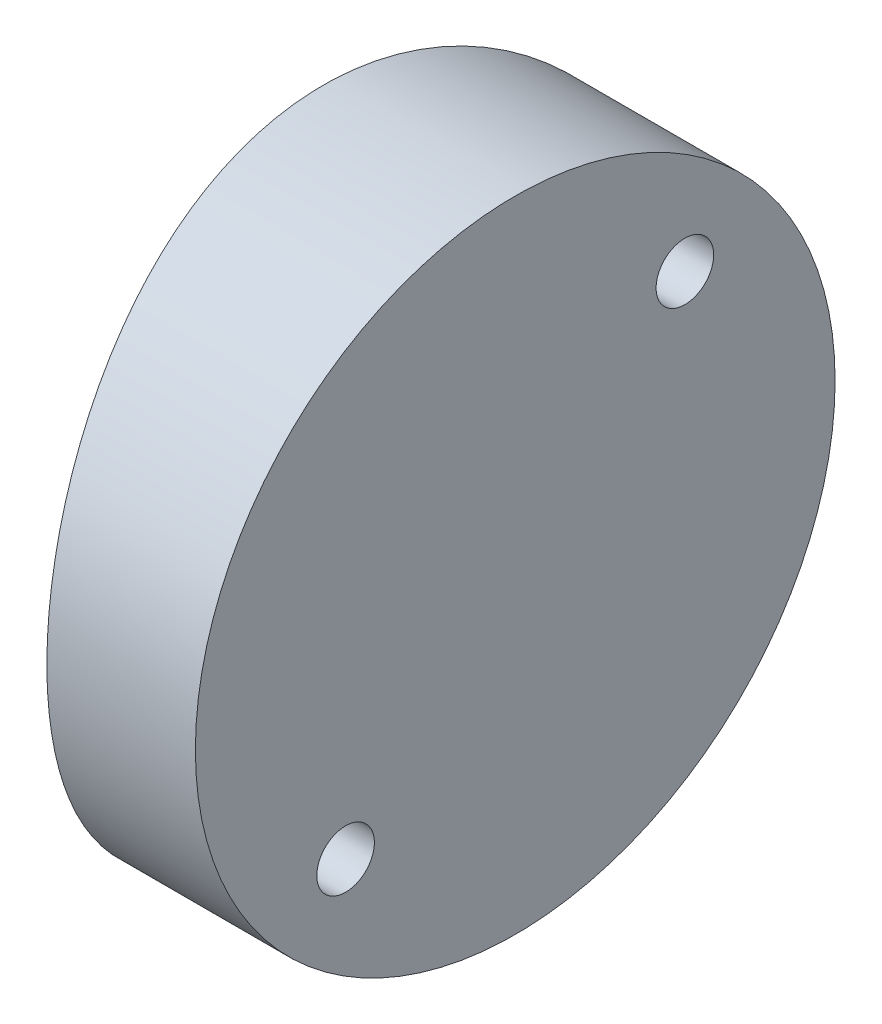
ISO-10303-21;
HEADER;
FILE_DESCRIPTION(('STEP AP214'),'2;1');
FILE_NAME('part.step','',(''),(''),'','','');
FILE_SCHEMA(('AUTOMOTIVE_DESIGN { 1 0 10303 214 1 1 1 1 }'));
ENDSEC;
DATA;
#1=APPLICATION_CONTEXT('core data for automotive mechanical design processes');
#2=APPLICATION_PROTOCOL_DEFINITION('international standard','automotive_design',2000,#1);
#3=PRODUCT_CONTEXT('',#1,'mechanical');
#4=PRODUCT('Part','Part','',(#3));
#5=PRODUCT_RELATED_PRODUCT_CATEGORY('part','',(#4));
#6=PRODUCT_DEFINITION_FORMATION('','',#4);
#7=PRODUCT_DEFINITION_CONTEXT('part definition',#1,'design');
#8=PRODUCT_DEFINITION('design','',#6,#7);
#9=PRODUCT_DEFINITION_SHAPE('','',#8);
#10=(LENGTH_UNIT() NAMED_UNIT(*) SI_UNIT(.MILLI.,.METRE.));
#11=(NAMED_UNIT(*) PLANE_ANGLE_UNIT() SI_UNIT($,.RADIAN.));
#12=(NAMED_UNIT(*) SI_UNIT($,.STERADIAN.) SOLID_ANGLE_UNIT());
#13=UNCERTAINTY_MEASURE_WITH_UNIT(LENGTH_MEASURE(1.E-05),#10,'distance_accuracy_value','');
#14=(GEOMETRIC_REPRESENTATION_CONTEXT(3) GLOBAL_UNCERTAINTY_ASSIGNED_CONTEXT((#13)) GLOBAL_UNIT_ASSIGNED_CONTEXT((#10,
#11,#12)) REPRESENTATION_CONTEXT('',''));
#15=CARTESIAN_POINT('',(0.,0.,0.));
#16=DIRECTION('',(0.,0.,1.));
#17=DIRECTION('',(1.,0.,0.));
#18=AXIS2_PLACEMENT_3D('',#15,#16,#17);
#19=CARTESIAN_POINT('',(12.,0.,0.));
#20=DIRECTION('',(-1.,0.,0.));
#21=DIRECTION('',(0.,0.,1.));
#22=AXIS2_PLACEMENT_3D('',#19,#20,#21);
#23=CYLINDRICAL_SURFACE('',#22,20.);
#24=CARTESIAN_POINT('',(12.,0.,0.));
#25=DIRECTION('',(1.,0.,0.));
#26=DIRECTION('',(0.,0.,-1.));
#27=AXIS2_PLACEMENT_3D('',#24,#25,#26);
#28=CIRCLE('',#27,20.);
#29=CARTESIAN_POINT('',(12.,0.,-20.));
#30=VERTEX_POINT('',#29);
#31=EDGE_CURVE('E10',#30,#30,#28,.T.);
#32=ORIENTED_EDGE('',*,*,#31,.F.);
#33=EDGE_LOOP('',(#32));
#34=FACE_BOUND('',#33,.T.);
#35=CARTESIAN_POINT('',(2.71583852599519,0.,20.));
#36=CARTESIAN_POINT('',(2.71583720419908,0.550918368629555,19.9999979955262));
#37=CARTESIAN_POINT('',(2.70952307294359,1.10187503845956,19.9772172985185));
#38=CARTESIAN_POINT('',(2.68445738640584,2.1997741525709,19.8862887267972));
#39=CARTESIAN_POINT('',(2.66570466817441,2.74671621667071,19.818136610068));
#40=CARTESIAN_POINT('',(2.61632654224703,3.83283472874256,19.6370216003391));
#41=CARTESIAN_POINT('',(2.58569585426865,4.3720076122554,19.5240387775898));
#42=CARTESIAN_POINT('',(2.51348978860518,5.43849703067202,19.2542283143095));
#43=CARTESIAN_POINT('',(2.4719146207721,5.96581379269742,19.0974015144497));
#44=CARTESIAN_POINT('',(2.37912003517492,7.00423404343053,18.7414391089101));
#45=CARTESIAN_POINT('',(2.32791448031755,7.51535961864346,18.5423642668867));
#46=CARTESIAN_POINT('',(2.21730121654067,8.51880006208397,18.1033138320795));
#47=CARTESIAN_POINT('',(2.15789347626827,9.01111485839805,17.8633380829508));
#48=CARTESIAN_POINT('',(2.03254969547388,9.97379657844629,17.3442340818241));
#49=CARTESIAN_POINT('',(1.96661339403171,10.4441626238714,17.0651042648105));
#50=CARTESIAN_POINT('',(1.83003053260491,11.3599958582745,16.4696340357336));
#51=CARTESIAN_POINT('',(1.7593838927973,11.8054626250655,16.1532929930068));
#52=CARTESIAN_POINT('',(1.61365604823284,12.6785221427699,15.4779359071113));
#53=CARTESIAN_POINT('',(1.53851069818374,13.1054831814473,15.1181168094535));
#54=CARTESIAN_POINT('',(1.38737000475925,13.927766105388,14.3641394304632));
#55=CARTESIAN_POINT('',(1.31137464949402,14.3230875474461,13.9699806682643));
#56=CARTESIAN_POINT('',(1.16060916641372,15.0795578950723,13.1498357209291));
#57=CARTESIAN_POINT('',(1.0858391620587,15.4407033745363,12.7238463524525));
#58=CARTESIAN_POINT('',(0.939569981410207,16.1263607771595,11.8428070794406));
#59=CARTESIAN_POINT('',(0.868070822169677,16.4508725093371,11.3877570234234));
#60=CARTESIAN_POINT('',(0.729185410938314,17.0659051030184,10.4440019186042));
#61=CARTESIAN_POINT('',(0.661883679341344,17.3557961932459,9.95487366219161));
#62=CARTESIAN_POINT('',(0.534574695396652,17.8932321652887,8.95295539825706));
#63=CARTESIAN_POINT('',(0.47456754471148,18.140776456948,8.44016506110064));
#64=CARTESIAN_POINT('',(0.363570717175421,18.5915117491791,7.39457532709894));
#65=CARTESIAN_POINT('',(0.312579865798712,18.7947085275753,6.86177854741084));
#66=CARTESIAN_POINT('',(0.221081799935856,19.1550779678764,5.77996599006893));
#67=CARTESIAN_POINT('',(0.180574306630333,19.3122518538382,5.23095064420305));
#68=CARTESIAN_POINT('',(0.112021066604811,19.5761398421684,4.13351206913606));
#69=CARTESIAN_POINT('',(0.0837111230618383,19.6839273166135,3.58536334092753));
#70=CARTESIAN_POINT('',(0.0390282051130342,19.8533116675331,2.4814919821342));
#71=CARTESIAN_POINT('',(0.0226550656279587,19.9149091827889,1.92576945639901));
#72=CARTESIAN_POINT('',(0.00231287184317546,19.9913590232856,0.810972743979539));
#73=CARTESIAN_POINT('',(-0.00165798564619358,20.0062181439063,0.251899056370222));
#74=CARTESIAN_POINT('',(0.00291290405673769,19.9890756548836,-0.865473785968115));
#75=CARTESIAN_POINT('',(0.0114544730304575,19.9570747126834,-1.42377295161553));
#76=CARTESIAN_POINT('',(0.0404339869592479,19.8479018321359,-2.52135571769307));
#77=CARTESIAN_POINT('',(0.0605659765902263,19.7718913424225,-3.06076341662817));
#78=CARTESIAN_POINT('',(0.111941054107678,19.5762680740784,-4.13106184083254));
#79=CARTESIAN_POINT('',(0.143183922711534,19.4566561559578,-4.66195273397211));
#80=CARTESIAN_POINT('',(0.215946928393699,19.1748040741018,-5.71158477741187));
#81=CARTESIAN_POINT('',(0.257467421868833,19.0125624320849,-6.23032550569826));
#82=CARTESIAN_POINT('',(0.349687153961002,18.6467294349784,-7.25217189173379));
#83=CARTESIAN_POINT('',(0.400386537541423,18.443137426831,-7.7552773024053));
#84=CARTESIAN_POINT('',(0.510180514018348,17.9939181773118,-8.74748028027973));
#85=CARTESIAN_POINT('',(0.56935336775221,17.7478941379886,-9.2363894798745));
#86=CARTESIAN_POINT('',(0.694148187869852,17.2170307081084,-10.1917867213776));
#87=CARTESIAN_POINT('',(0.759770176450058,16.9321911839563,-10.6582746861091));
#88=CARTESIAN_POINT('',(0.895758703670676,16.3256216075623,-11.5659888188201));
#89=CARTESIAN_POINT('',(0.966126011005286,16.0038855725124,-12.0072108724652));
#90=CARTESIAN_POINT('',(1.10976484930651,15.3256861572232,-12.86160363953));
#91=CARTESIAN_POINT('',(1.18303644148927,14.9692220447586,-13.2747737611759));
#92=CARTESIAN_POINT('',(1.33284428810774,14.2123742214188,-14.0827611991668));
#93=CARTESIAN_POINT('',(1.40941167732709,13.8109775618472,-14.4766245221965));
#94=CARTESIAN_POINT('',(1.56147492697535,12.976336337106,-15.2292640199665));
#95=CARTESIAN_POINT('',(1.63697076475668,12.5430910999988,-15.5880394540543));
#96=CARTESIAN_POINT('',(1.78476784142875,11.6475416526047,-16.2680947594536));
#97=CARTESIAN_POINT('',(1.85706886150449,11.1852354571523,-16.5893720649617));
#98=CARTESIAN_POINT('',(1.99639557790192,10.234611796305,-17.1921338759909));
#99=CARTESIAN_POINT('',(2.06342129853029,9.74629445077744,-17.4736185648671));
#100=CARTESIAN_POINT('',(2.19062493961388,8.74378523222317,-17.9963259710692));
#101=CARTESIAN_POINT('',(2.25075776920321,8.22945155829049,-18.2372879132319));
#102=CARTESIAN_POINT('',(2.36185979063246,7.18129056511593,-18.6748920170533));
#103=CARTESIAN_POINT('',(2.41282891253737,6.64746309713994,-18.8715338404755));
#104=CARTESIAN_POINT('',(2.50400123028059,5.56425978861829,-19.2188038342948));
#105=CARTESIAN_POINT('',(2.54420661443119,5.0148871336236,-19.3694413584335));
#106=CARTESIAN_POINT('',(2.61257838013558,3.9045821944646,-19.6234178199717));
#107=CARTESIAN_POINT('',(2.64074512950106,3.34365026401526,-19.726758202429));
#108=CARTESIAN_POINT('',(2.68347601664323,2.23140756936548,-19.8828242188132));
#109=CARTESIAN_POINT('',(2.69842161742293,1.68031046308461,-19.9369705715048));
#110=CARTESIAN_POINT('',(2.71565957980208,0.575330472434,-19.9993798372479));
#111=CARTESIAN_POINT('',(2.71795219245947,0.021447643556242,-20.007643660691));
#112=CARTESIAN_POINT('',(2.70981317788567,-1.08494461677384,-19.9782160173178));
#113=CARTESIAN_POINT('',(2.69938279257724,-1.63745417699944,-19.9405290358714));
#114=CARTESIAN_POINT('',(2.66612442334991,-2.73707469895268,-19.8195451229315));
#115=CARTESIAN_POINT('',(2.64329650747951,-3.2841856902956,-19.736248441784));
#116=CARTESIAN_POINT('',(2.58650048179624,-4.35857469453259,-19.5268172340599));
#117=CARTESIAN_POINT('',(2.55275540867861,-4.88603174019373,-19.4015386960339));
#118=CARTESIAN_POINT('',(2.47500448611204,-5.92832913382976,-19.1088443049987));
#119=CARTESIAN_POINT('',(2.43099880347104,-6.4431696867621,-18.9414291370062));
#120=CARTESIAN_POINT('',(2.33397826704948,-7.45689813088412,-18.5657450389627));
#121=CARTESIAN_POINT('',(2.28096253333663,-7.95578445830565,-18.3574721183883));
#122=CARTESIAN_POINT('',(2.16740736150408,-8.93436137495364,-17.901636719721));
#123=CARTESIAN_POINT('',(2.10686775310598,-9.41405152941229,-17.6540733523817));
#124=CARTESIAN_POINT('',(1.97850743681508,-10.3616364681429,-17.11548661598));
#125=CARTESIAN_POINT('',(1.91055596885891,-10.8290404597269,-16.8236278146508));
#126=CARTESIAN_POINT('',(1.80546481084756,-11.5104486579926,-16.3580352677298));
#127=CARTESIAN_POINT('',(1.7699051851663,-11.7343127858372,-16.1981947427043));
#128=CARTESIAN_POINT('',(1.69796068661998,-12.1752320062407,-15.8694473258497));
#129=CARTESIAN_POINT('',(1.66157561938932,-12.3922854658165,-15.7005382856017));
#130=CARTESIAN_POINT('',(1.55156513794229,-13.0326274018404,-15.1806742573283));
#131=CARTESIAN_POINT('',(1.47707281306718,-13.4451720326612,-14.8165313697738));
#132=CARTESIAN_POINT('',(1.32780357156735,-14.238838083619,-14.0555240451393));
#133=CARTESIAN_POINT('',(1.25302665149377,-14.6199591216746,-13.6586592103083));
#134=CARTESIAN_POINT('',(1.14107642560371,-15.1714951873482,-13.0347928155079));
#135=CARTESIAN_POINT('',(1.10326703754078,-15.3543975844182,-12.8188356454708));
#136=CARTESIAN_POINT('',(1.02837237294425,-15.7108895289307,-12.3793376328829));
#137=CARTESIAN_POINT('',(0.991286922913547,-15.8844813255974,-12.1557986434176));
#138=CARTESIAN_POINT('',(0.881487716092404,-16.3909288120467,-11.4742218917358));
#139=CARTESIAN_POINT('',(0.810224975928936,-16.709486469754,-11.0051905556007));
#140=CARTESIAN_POINT('',(0.673619137262284,-17.3059300226829,-10.0412210351254));
#141=CARTESIAN_POINT('',(0.608275862067071,-17.5838171320454,-9.5462836247604));
#142=CARTESIAN_POINT('',(0.485340966914633,-18.0968632016066,-8.53378968620395));
#143=CARTESIAN_POINT('',(0.42774922037299,-18.3320228595772,-8.01623352756527));
#144=CARTESIAN_POINT('',(0.322366348557832,-18.7560885066583,-6.96615659435085));
#145=CARTESIAN_POINT('',(0.27450403894112,-18.945332565737,-6.43377951172493));
#146=CARTESIAN_POINT('',(0.189396189188018,-19.2782875530085,-5.35413230580835));
#147=CARTESIAN_POINT('',(0.152150629904706,-19.4219985633186,-4.80686220937866));
#148=CARTESIAN_POINT('',(0.089355017230541,-19.6626100524458,-3.7015671034604));
#149=CARTESIAN_POINT('',(0.0638028066489135,-19.7595191654669,-3.14354409748071));
#150=CARTESIAN_POINT('',(0.0251274383065969,-19.9056902137932,-2.02086921872247));
#151=CARTESIAN_POINT('',(0.0120039647265277,-19.9549533598029,-1.45621751475102));
#152=CARTESIAN_POINT('',(-0.00122587692838002,-20.0046098488838,-0.342006373503284));
#153=CARTESIAN_POINT('',(-0.00171951763861212,-20.0064571258491,0.207484191740474));
#154=CARTESIAN_POINT('',(0.00934129337656264,-19.9649517231006,1.30462513984724));
#155=CARTESIAN_POINT('',(0.0208954819801355,-19.921600030522,1.85227556263648));
#156=CARTESIAN_POINT('',(0.0557333619197663,-19.7900760707032,2.94176044403704));
#157=CARTESIAN_POINT('',(0.0790165566844254,-19.7019057009516,3.48359514787692));
#158=CARTESIAN_POINT('',(0.136675692879952,-19.4814944613198,4.55762066338955));
#159=CARTESIAN_POINT('',(0.171051683802468,-19.3492533948135,5.08981143202369));
#160=CARTESIAN_POINT('',(0.249691413832764,-19.0428564307918,6.13720586224474));
#161=CARTESIAN_POINT('',(0.293885071252294,-18.8689969684944,6.65250160135735));
#162=CARTESIAN_POINT('',(0.391125021808032,-18.4802494885517,7.66649937953356));
#163=CARTESIAN_POINT('',(0.444171243197424,-18.2653618034233,8.16520155304269));
#164=CARTESIAN_POINT('',(0.557737475067148,-17.796130197976,9.14285422000934));
#165=CARTESIAN_POINT('',(0.618258277244073,-17.5417820973358,9.6218026139965));
#166=CARTESIAN_POINT('',(0.745205728496283,-16.9954417686765,10.5569031827026));
#167=CARTESIAN_POINT('',(0.811632508969956,-16.7034487030534,11.0130548498786));
#168=CARTESIAN_POINT('',(0.950517062442474,-16.0755135025158,11.9116009680227));
#169=CARTESIAN_POINT('',(1.023088426918,-15.7386070110524,12.3533041573464));
#170=CARTESIAN_POINT('',(1.17070667771722,-15.0294641921924,13.2069343867793));
#171=CARTESIAN_POINT('',(1.24575360836312,-14.6572272320196,13.6188608933488));
#172=CARTESIAN_POINT('',(1.3963163105709,-13.8797585542876,14.4104174108039));
#173=CARTESIAN_POINT('',(1.47183219499279,-13.4745185854208,14.7900392961781));
#174=CARTESIAN_POINT('',(1.62125905673518,-12.6337145599183,15.5144184951873));
#175=CARTESIAN_POINT('',(1.69517002855606,-12.1981503993908,15.8591756893648));
#176=CARTESIAN_POINT('',(1.8409371391106,-11.2895484362826,16.5187203553849));
#177=CARTESIAN_POINT('',(1.91271216996388,-10.8158965832217,16.8326805368298));
#178=CARTESIAN_POINT('',(2.05034988167816,-9.84293313497395,17.4195128918304));
#179=CARTESIAN_POINT('',(2.11621229361854,-9.34362037428765,17.6923831968983));
#180=CARTESIAN_POINT('',(2.24000453908631,-8.32305943262842,18.1947791971653));
#181=CARTESIAN_POINT('',(2.29793893952687,-7.80182410827755,18.424329875673));
#182=CARTESIAN_POINT('',(2.40412815426479,-6.74084782086917,18.8383953760499));
#183=CARTESIAN_POINT('',(2.45238428596844,-6.20110938818302,19.0229163281093));
#184=CARTESIAN_POINT('',(2.53070778022321,-5.19676399129988,19.3189300896442));
#185=CARTESIAN_POINT('',(2.56245993531721,-4.73434070733534,19.4374352166582));
#186=CARTESIAN_POINT('',(2.61743880671688,-3.80156746564103,19.6411813358635));
#187=CARTESIAN_POINT('',(2.64066318278791,-3.33121536903039,19.726413197448));
#188=CARTESIAN_POINT('',(2.67803680605951,-2.38530218256131,19.8629973448247));
#189=CARTESIAN_POINT('',(2.69218689021724,-1.90974157722012,19.9143527551861));
#190=CARTESIAN_POINT('',(2.71108694192035,-0.956129746401022,19.9828499232124));
#191=CARTESIAN_POINT('',(2.71583967303146,-0.478079294611533,20.0000017394545));
#192=CARTESIAN_POINT('',(2.71583852599519,0.,20.));
#193=B_SPLINE_CURVE_WITH_KNOTS('',3,(#35,#36,#37,#38,#39,#40,#41,#42,#43,#44,#45,#46,#47,#48,
#49,#50,#51,#52,#53,#54,#55,#56,#57,#58,#59,#60,#61,#62,#63,#64,#65,#66,#67,#68,#69,#70,#71,#72,
#73,#74,#75,#76,#77,#78,#79,#80,#81,#82,#83,#84,#85,#86,#87,#88,#89,#90,#91,#92,#93,#94,#95,#96,
#97,#98,#99,#100,#101,#102,#103,#104,#105,#106,#107,#108,#109,#110,#111,#112,#113,#114,#115,
#116,#117,#118,#119,#120,#121,#122,#123,#124,#125,#126,#127,#128,#129,#130,#131,#132,#133,#134,
#135,#136,#137,#138,#139,#140,#141,#142,#143,#144,#145,#146,#147,#148,#149,#150,#151,#152,#153,
#154,#155,#156,#157,#158,#159,#160,#161,#162,#163,#164,#165,#166,#167,#168,#169,#170,#171,#172,
#173,#174,#175,#176,#177,#178,#179,#180,#181,#182,#183,#184,#185,#186,#187,#188,#189,#190,#191,
#192),.UNSPECIFIED.,.T.,.F.,(4,2,2,2,2,2,2,2,2,2,2,2,2,2,2,2,2,2,2,2,2,2,2,2,2,2,2,2,2,2,2,2,2,
2,2,2,2,2,2,2,2,2,2,2,2,2,2,2,2,2,2,2,2,2,2,2,2,2,2,2,2,2,2,2,2,2,2,2,2,2,2,2,2,2,2,2,2,2,4),
(0.,1.65231646724918,3.30478744006707,4.95799385294111,6.61116856915921,8.26198151246524,
9.91280076618765,11.563686023129,13.2145992636445,14.9028332573599,16.5910908956041,
18.2795176009991,19.9679531082101,21.6835116813128,23.3990941609388,25.1144529919578,
26.8297661959518,28.5057881570069,30.1817869391871,31.8575420336015,33.5332732599203,
35.1666751391554,36.8000447836081,38.4334710762973,40.0669231681476,41.716572363803,
43.3662272373671,45.016149983437,46.6661075248883,48.3667622821504,50.0674529299349,
51.7682598790722,53.4690589910375,55.1804159110329,56.8917858911011,58.6028076779203,
60.3137771848222,61.9735992876109,63.6333884564392,65.2930156221762,66.9526336785195,
68.5802863037356,70.2079124698566,71.8356976833209,73.4635197431162,75.127110556269,
75.95899168933,76.7910707802654,78.454956484337,80.1188624167173,80.9751899408172,
81.831309655657,83.54341297765,85.2554651776656,86.9674894160441,88.6664972596542,
90.3655020391462,92.0641932594963,93.7628413142374,95.4093386147798,97.0557999569512,
98.7021915986812,100.348590586058,101.983594533906,103.618585231283,105.253749253225,
106.888949664009,108.567756622397,110.246593654259,111.925851719845,113.605115538909,
115.321363854389,117.037690189607,118.753023639167,120.468123438766,121.902141616166,
123.336553030226,124.77083212392,126.204689363247),.UNSPECIFIED.);
#194=CARTESIAN_POINT('',(2.71583852599519,0.,20.));
#195=VERTEX_POINT('',#194);
#196=EDGE_CURVE('E78',#195,#195,#193,.T.);
#197=ORIENTED_EDGE('',*,*,#196,.F.);
#198=EDGE_LOOP('',(#197));
#199=FACE_BOUND('',#198,.T.);
#200=ADVANCED_FACE('F37',(#34,#199),#23,.T.);
#201=CARTESIAN_POINT('',(0.,10.6066017177982,-10.6066017177982));
#202=DIRECTION('',(-1.,0.,0.));
#203=DIRECTION('',(0.,0.,1.));
#204=AXIS2_PLACEMENT_3D('',#201,#202,#203);
#205=CYLINDRICAL_SURFACE('',#204,3.25);
#206=CARTESIAN_POINT('',(3.,10.6066017177982,-10.6066017177982));
#207=DIRECTION('',(-1.,0.,0.));
#208=DIRECTION('',(0.,0.,1.));
#209=AXIS2_PLACEMENT_3D('',#206,#207,#208);
#210=CIRCLE('',#209,3.25);
#211=CARTESIAN_POINT('',(3.,10.6066017177982,-7.35660171779819));
#212=VERTEX_POINT('',#211);
#213=EDGE_CURVE('E62',#212,#212,#210,.T.);
#214=ORIENTED_EDGE('',*,*,#213,.F.);
#215=EDGE_LOOP('',(#214));
#216=FACE_BOUND('',#215,.T.);
#217=CARTESIAN_POINT('',(0.361669290064565,10.6066017177982,-7.35660171779819));
#218=CARTESIAN_POINT('',(0.361669491253666,10.4247817441727,-7.35660981409008));
#219=CARTESIAN_POINT('',(0.363173374963747,10.2428318554134,-7.37191164208531));
#220=CARTESIAN_POINT('',(0.369205696408324,9.88395321182915,-7.43272758149798));
#221=CARTESIAN_POINT('',(0.373737716096102,9.70703066248967,-7.47827747266996));
#222=CARTESIAN_POINT('',(0.385857819183601,9.3634628181239,-7.5982498207266));
#223=CARTESIAN_POINT('',(0.393444264809145,9.19681207051897,-7.67265680373963));
#224=CARTESIAN_POINT('',(0.411701645958583,8.87845477135911,-7.84815223820529));
#225=CARTESIAN_POINT('',(0.422371831499537,8.72674459818623,-7.94923420163349));
#226=CARTESIAN_POINT('',(0.446818001389398,8.44223882424831,-8.17532653064184));
#227=CARTESIAN_POINT('',(0.460598890539628,8.30947364050608,-8.30037463731854));
#228=CARTESIAN_POINT('',(0.491194767132771,8.06682303443066,-8.57067115615543));
#229=CARTESIAN_POINT('',(0.508009919452962,7.95693885611597,-8.71592066593097));
#230=CARTESIAN_POINT('',(0.544597892151938,7.76260006823425,-9.02314245569584));
#231=CARTESIAN_POINT('',(0.564383900801932,7.6782641827226,-9.18518825101223));
#232=CARTESIAN_POINT('',(0.606566939600776,7.53794922311722,-9.52080346969049));
#233=CARTESIAN_POINT('',(0.628964062028339,7.48197115158376,-9.69437330022701));
#234=CARTESIAN_POINT('',(0.676109099117234,7.39949185408823,-10.0494544399939));
#235=CARTESIAN_POINT('',(0.700873240708862,7.37321268591841,-10.2310151644672));
#236=CARTESIAN_POINT('',(0.752009781924129,7.35148834686736,-10.5957473710971));
#237=CARTESIAN_POINT('',(0.778382260993168,7.35604470036134,-10.7789189324393));
#238=CARTESIAN_POINT('',(0.832206719598493,7.39594127597758,-11.1432775734134));
#239=CARTESIAN_POINT('',(0.859665794147146,7.43153439839019,-11.324435937188));
#240=CARTESIAN_POINT('',(0.914556010745288,7.53281857102928,-11.6781438846403));
#241=CARTESIAN_POINT('',(0.941987151630844,7.59851082781075,-11.8506931229047));
#242=CARTESIAN_POINT('',(0.995928759083908,7.75852162005185,-12.1830176981838));
#243=CARTESIAN_POINT('',(1.02243501521681,7.85295579468905,-12.342738076911));
#244=CARTESIAN_POINT('',(1.07333532785501,8.06778422393731,-12.6440354163488));
#245=CARTESIAN_POINT('',(1.09772941258979,8.18817813151771,-12.7856126195576));
#246=CARTESIAN_POINT('',(1.14321504892813,8.45094493100867,-13.0457928087777));
#247=CARTESIAN_POINT('',(1.16432284738586,8.59320230658796,-13.1645095517954));
#248=CARTESIAN_POINT('',(1.20239323428003,8.89618154415262,-13.3762794251756));
#249=CARTESIAN_POINT('',(1.21935615039162,9.05690194505922,-13.4693345842986));
#250=CARTESIAN_POINT('',(1.24808863790925,9.38986958938576,-13.6257784996404));
#251=CARTESIAN_POINT('',(1.25992712699551,9.56192553118166,-13.6895616832229));
#252=CARTESIAN_POINT('',(1.27814535833735,9.91457754999386,-13.7873364991262));
#253=CARTESIAN_POINT('',(1.28452561895593,10.0951728143191,-13.8213309604624));
#254=CARTESIAN_POINT('',(1.29144253907176,10.4569794100747,-13.8581711200689));
#255=CARTESIAN_POINT('',(1.29206223941064,10.6381441996306,-13.8614594628002));
#256=CARTESIAN_POINT('',(1.2876433459333,10.9984338586469,-13.8379411582888));
#257=CARTESIAN_POINT('',(1.28260497843471,11.1775588094095,-13.8111357147704));
#258=CARTESIAN_POINT('',(1.26716553585886,11.5278403943004,-13.7284689457394));
#259=CARTESIAN_POINT('',(1.25678947624093,11.6990301729292,-13.6727431467645));
#260=CARTESIAN_POINT('',(1.23120350221228,12.0295819472654,-13.5340167580511));
#261=CARTESIAN_POINT('',(1.21599341717841,12.1889435252362,-13.4510152055761));
#262=CARTESIAN_POINT('',(1.1813142909551,12.4928160373685,-13.2593803037248));
#263=CARTESIAN_POINT('',(1.16181025676634,12.6371897063486,-13.1505357420897));
#264=CARTESIAN_POINT('',(1.11950732280818,12.9056847958215,-12.9107547859995));
#265=CARTESIAN_POINT('',(1.09670815845785,13.0298045883333,-12.7798166174069));
#266=CARTESIAN_POINT('',(1.04841614400928,13.2562793768033,-12.497361547372));
#267=CARTESIAN_POINT('',(1.02288741505382,13.3582722838768,-12.3455604216969));
#268=CARTESIAN_POINT('',(0.970464299418009,13.5353466491196,-12.027212569663));
#269=CARTESIAN_POINT('',(0.94356981659608,13.6104262097305,-11.8606648046064));
#270=CARTESIAN_POINT('',(0.889086370812263,13.7323968345968,-11.5153534853803));
#271=CARTESIAN_POINT('',(0.861492948846028,13.7789399946039,-11.3364676453048));
#272=CARTESIAN_POINT('',(0.806872840260695,13.8410972465439,-10.9733125491846));
#273=CARTESIAN_POINT('',(0.779846167717005,13.8567105712222,-10.7890431597091));
#274=CARTESIAN_POINT('',(0.727115010463601,13.8564914548064,-10.4198564265013));
#275=CARTESIAN_POINT('',(0.701413994899647,13.8405804150818,-10.2349386135861));
#276=CARTESIAN_POINT('',(0.652085085335745,13.7774849700033,-9.87022898858078));
#277=CARTESIAN_POINT('',(0.628457141882396,13.7303013108917,-9.69043705428122));
#278=CARTESIAN_POINT('',(0.583915430746449,13.6062350452583,-9.34221712763719));
#279=CARTESIAN_POINT('',(0.562987015480626,13.5295225689212,-9.1737304139331));
#280=CARTESIAN_POINT('',(0.524036811184985,13.3484635558487,-8.85196034163089));
#281=CARTESIAN_POINT('',(0.506014781926756,13.2441193049132,-8.69867572690132));
#282=CARTESIAN_POINT('',(0.473222383680252,13.0117167489198,-8.41308178130738));
#283=CARTESIAN_POINT('',(0.458425601167397,12.8838682144189,-8.2806047582242));
#284=CARTESIAN_POINT('',(0.431976236338402,12.6074379711318,-8.03894596607545));
#285=CARTESIAN_POINT('',(0.42032431164954,12.4588519357267,-7.92976907034174));
#286=CARTESIAN_POINT('',(0.400246226598607,12.1462279348179,-7.73860115218916));
#287=CARTESIAN_POINT('',(0.391800281832612,11.9822927894729,-7.65644382445929));
#288=CARTESIAN_POINT('',(0.378011383876138,11.6429742120864,-7.52087115171056));
#289=CARTESIAN_POINT('',(0.372664672209464,11.4676049348296,-7.46742099896938));
#290=CARTESIAN_POINT('',(0.366451379741313,11.177032356707,-7.40499576357388));
#291=CARTESIAN_POINT('',(0.364657973907615,11.0637318625503,-7.38687151623983));
#292=CARTESIAN_POINT('',(0.36226686680132,10.8358387003037,-7.36267195254044));
#293=CARTESIAN_POINT('',(0.361669163207286,10.7212460347229,-7.35659661278231));
#294=CARTESIAN_POINT('',(0.361669290064565,10.6066017177982,-7.35660171779819));
#295=B_SPLINE_CURVE_WITH_KNOTS('',3,(#217,#218,#219,#220,#221,#222,#223,#224,#225,#226,#227,
#228,#229,#230,#231,#232,#233,#234,#235,#236,#237,#238,#239,#240,#241,#242,#243,#244,#245,#246,
#247,#248,#249,#250,#251,#252,#253,#254,#255,#256,#257,#258,#259,#260,#261,#262,#263,#264,#265,
#266,#267,#268,#269,#270,#271,#272,#273,#274,#275,#276,#277,#278,#279,#280,#281,#282,#283,#284,
#285,#286,#287,#288,#289,#290,#291,#292,#293,#294),.UNSPECIFIED.,.T.,.F.,(4,2,2,2,2,2,2,2,2,2,2,
2,2,2,2,2,2,2,2,2,2,2,2,2,2,2,2,2,2,2,2,2,2,2,2,2,2,2,4),(0.,0.545040997645831,1.09072786320028,
1.63612252191403,2.1813846490329,2.72751259921171,3.27367023409952,3.82232827218416,
4.37100570613522,4.92375899092404,5.47653960165124,6.03386703470814,6.59121681076792,
7.15083933383569,7.71045437631287,8.26720833964419,8.82391827434342,9.37288904561202,
9.92180767583401,10.4628009285478,11.0037725427893,11.5422316464251,12.0807097577807,
12.6237502356578,13.166834340967,13.7182283191945,14.2696611664828,14.8276897084371,
15.3857320928385,15.945167576346,16.5045897108175,17.0608358465263,17.6170359819142,
18.1684939665368,18.7200671784133,19.2681789935251,19.8156247088315,20.1592941800166,
20.5029629839718),.UNSPECIFIED.);
#296=CARTESIAN_POINT('',(0.361669290064565,10.6066017177982,-7.35660171779819));
#297=VERTEX_POINT('',#296);
#298=EDGE_CURVE('E85',#297,#297,#295,.T.);
#299=ORIENTED_EDGE('',*,*,#298,.F.);
#300=EDGE_LOOP('',(#299));
#301=FACE_BOUND('',#300,.T.);
#302=ADVANCED_FACE('F102',(#216,#301),#205,.F.);
#303=CARTESIAN_POINT('',(0.,-10.6066017177982,10.6066017177982));
#304=DIRECTION('',(-1.,0.,0.));
#305=DIRECTION('',(0.,0.,1.));
#306=AXIS2_PLACEMENT_3D('',#303,#304,#305);
#307=CYLINDRICAL_SURFACE('',#306,3.25);
#308=CARTESIAN_POINT('',(3.,-10.6066017177982,10.6066017177982));
#309=DIRECTION('',(-1.,0.,0.));
#310=DIRECTION('',(0.,0.,1.));
#311=AXIS2_PLACEMENT_3D('',#308,#309,#310);
#312=CIRCLE('',#311,3.25);
#313=CARTESIAN_POINT('',(3.,-10.6066017177982,13.8566017177982));
#314=VERTEX_POINT('',#313);
#315=EDGE_CURVE('E74',#314,#314,#312,.T.);
#316=ORIENTED_EDGE('',*,*,#315,.F.);
#317=EDGE_LOOP('',(#316));
#318=FACE_BOUND('',#317,.T.);
#319=CARTESIAN_POINT('',(1.29114986085922,-10.6066017177982,13.8566017177982));
#320=CARTESIAN_POINT('',(1.29114769079145,-10.7869787496904,13.8565933662633));
#321=CARTESIAN_POINT('',(1.28831165456914,-10.9674859027901,13.841530444954));
#322=CARTESIAN_POINT('',(1.27710220789443,-11.323476946845,13.7816991045263));
#323=CARTESIAN_POINT('',(1.2687221960796,-11.4989545888211,13.7368952718817));
#324=CARTESIAN_POINT('',(1.24685623626719,-11.8396311079578,13.6190071057666));
#325=CARTESIAN_POINT('',(1.23337485533413,-12.0048390256407,13.5459480668369));
#326=CARTESIAN_POINT('',(1.20196637762989,-12.3205397233723,13.3737748698262));
#327=CARTESIAN_POINT('',(1.1840401642989,-12.4710354192961,13.2746658891107));
#328=CARTESIAN_POINT('',(1.14439807204164,-12.754560984274,13.0523135536157));
#329=CARTESIAN_POINT('',(1.12265071357288,-12.8874282814503,12.9288685929351));
#330=CARTESIAN_POINT('',(1.07643128655411,-13.1306391283659,12.6619234700901));
#331=CARTESIAN_POINT('',(1.05195891027085,-13.2409801302412,12.5184210423903));
#332=CARTESIAN_POINT('',(1.0009014105952,-13.4377567545149,12.2130137137927));
#333=CARTESIAN_POINT('',(0.974289675698877,-13.5238004905286,12.0508606912543));
#334=CARTESIAN_POINT('',(0.92031814662919,-13.6673997823402,11.7145092385422));
#335=CARTESIAN_POINT('',(0.892958308134702,-13.7249536463899,11.5403100937615));
#336=CARTESIAN_POINT('',(0.838196920000574,-13.8103953260735,11.1830187201347));
#337=CARTESIAN_POINT('',(0.810797370906401,-13.8380008190735,10.9998585857213));
#338=CARTESIAN_POINT('',(0.757093817331939,-13.8617482182331,10.6313474299752));
#339=CARTESIAN_POINT('',(0.730789816882106,-13.8578900086499,10.4459964005855));
#340=CARTESIAN_POINT('',(0.680024546041221,-13.8187217928725,10.0784746452616));
#341=CARTESIAN_POINT('',(0.655562406921152,-13.7834267161997,9.89630245154911));
#342=CARTESIAN_POINT('',(0.609043086222289,-13.6822779596231,9.5403233073779));
#343=CARTESIAN_POINT('',(0.586985823331066,-13.616425313312,9.36651607419854));
#344=CARTESIAN_POINT('',(0.545836425338407,-13.4565056212852,9.03357602590692));
#345=CARTESIAN_POINT('',(0.526724186962109,-13.3626440077928,8.87434703509709));
#346=CARTESIAN_POINT('',(0.491531843143533,-13.1491261820884,8.57386100199297));
#347=CARTESIAN_POINT('',(0.475451603272191,-13.0294711139796,8.43260316300596));
#348=CARTESIAN_POINT('',(0.446572874141354,-12.7688296949824,8.17333597087218));
#349=CARTESIAN_POINT('',(0.433748467544078,-12.6280269873078,8.05514486649933));
#350=CARTESIAN_POINT('',(0.411247591565525,-12.3283632319226,7.84406264295708));
#351=CARTESIAN_POINT('',(0.401571019504865,-12.1695027734669,7.75117069856912));
#352=CARTESIAN_POINT('',(0.385397518451231,-11.8392394794852,7.59390153159486));
#353=CARTESIAN_POINT('',(0.378882348117893,-11.667915320037,7.52936093104206));
#354=CARTESIAN_POINT('',(0.368913388879593,-11.3167896865176,7.42990117254961));
#355=CARTESIAN_POINT('',(0.365459543717687,-11.1369883682923,7.39498147027716));
#356=CARTESIAN_POINT('',(0.361592288424922,-10.774578966799,7.35584715845999));
#357=CARTESIAN_POINT('',(0.361169978041473,-10.5919806783286,7.3515426663691));
#358=CARTESIAN_POINT('',(0.363338576865622,-10.2286541060342,7.37352622576414));
#359=CARTESIAN_POINT('',(0.3659294621943,-10.0479258074024,7.39981403481274));
#360=CARTESIAN_POINT('',(0.374142488198684,-9.69359703088795,7.48218444162235));
#361=CARTESIAN_POINT('',(0.379762528492007,-9.5199917036688,7.53824639392914));
#362=CARTESIAN_POINT('',(0.39406632506482,-9.18468829871279,7.67851558151675));
#363=CARTESIAN_POINT('',(0.402750081066082,-9.02299021989459,7.76272281424159));
#364=CARTESIAN_POINT('',(0.423217972468856,-8.7158572895614,7.95695252455398));
#365=CARTESIAN_POINT('',(0.43500599789411,-8.57044317197719,8.06700737347384));
#366=CARTESIAN_POINT('',(0.461659567607681,-8.30017522545118,8.30967301489952));
#367=CARTESIAN_POINT('',(0.4765251492498,-8.17532164609567,8.44228408117766));
#368=CARTESIAN_POINT('',(0.509300648538278,-7.9491951898349,8.72675452948365));
#369=CARTESIAN_POINT('',(0.527221551754075,-7.84801064491201,8.87868284813739));
#370=CARTESIAN_POINT('',(0.565865633676817,-7.67255376167482,9.19702781685231));
#371=CARTESIAN_POINT('',(0.586588894480264,-7.59828221202516,9.36344489131813));
#372=CARTESIAN_POINT('',(0.630644746463643,-7.47820181539206,9.70717218008111));
#373=CARTESIAN_POINT('',(0.653993648525898,-7.43258395676623,9.88454701021363));
#374=CARTESIAN_POINT('',(0.702691950381567,-7.37172875387642,10.2441659108503));
#375=CARTESIAN_POINT('',(0.728041451325482,-7.35649294675666,10.4264102272477));
#376=CARTESIAN_POINT('',(0.780309230096913,-7.35671257291459,10.7922156694922));
#377=CARTESIAN_POINT('',(0.807238878005642,-7.37242637380608,10.9757750263018));
#378=CARTESIAN_POINT('',(0.861658904172897,-7.43454960875673,11.3375419581561));
#379=CARTESIAN_POINT('',(0.889149309443159,-7.48096052489897,11.5157492743654));
#380=CARTESIAN_POINT('',(0.943921860294983,-7.60355225101058,11.8628991550248));
#381=CARTESIAN_POINT('',(0.971201727102256,-7.67991214887985,12.0317788793633));
#382=CARTESIAN_POINT('',(1.02434171568875,-7.86029719850318,12.3542999201881));
#383=CARTESIAN_POINT('',(1.05020187990461,-7.96432152278983,12.5079416922663));
#384=CARTESIAN_POINT('',(1.09937701074435,-8.19697544935623,12.7952790062101));
#385=CARTESIAN_POINT('',(1.12269681980038,-8.32555690465311,12.9290126819481));
#386=CARTESIAN_POINT('',(1.1658028769595,-8.60395753827227,13.1729542589881));
#387=CARTESIAN_POINT('',(1.18558845755599,-8.75378071893601,13.2831577169248));
#388=CARTESIAN_POINT('',(1.22046678917503,-9.06861361368265,13.4755319488372));
#389=CARTESIAN_POINT('',(1.23560943688844,-9.23343523453037,13.5580017755579));
#390=CARTESIAN_POINT('',(1.26072339949342,-9.5748411259014,13.6939371187784));
#391=CARTESIAN_POINT('',(1.2707015296525,-9.75140954571224,13.7474408641854));
#392=CARTESIAN_POINT('',(1.28225343253266,-10.0420938341509,13.8092132685077));
#393=CARTESIAN_POINT('',(1.28558253162243,-10.1542150129865,13.8269593333674));
#394=CARTESIAN_POINT('',(1.29003141681158,-10.3797408825679,13.8506561233929));
#395=CARTESIAN_POINT('',(1.29115122581988,-10.4931455599923,13.8566069708676));
#396=CARTESIAN_POINT('',(1.29114986085922,-10.6066017177982,13.8566017177982));
#397=B_SPLINE_CURVE_WITH_KNOTS('',3,(#319,#320,#321,#322,#323,#324,#325,#326,#327,#328,#329,
#330,#331,#332,#333,#334,#335,#336,#337,#338,#339,#340,#341,#342,#343,#344,#345,#346,#347,#348,
#349,#350,#351,#352,#353,#354,#355,#356,#357,#358,#359,#360,#361,#362,#363,#364,#365,#366,#367,
#368,#369,#370,#371,#372,#373,#374,#375,#376,#377,#378,#379,#380,#381,#382,#383,#384,#385,#386,
#387,#388,#389,#390,#391,#392,#393,#394,#395,#396),.UNSPECIFIED.,.T.,.F.,(4,2,2,2,2,2,2,2,2,2,2,
2,2,2,2,2,2,2,2,2,2,2,2,2,2,2,2,2,2,2,2,2,2,2,2,2,2,2,4),(0.,0.540712906492604,1.08207081615627,
1.6229452106551,2.1637121887993,2.70916305227082,3.25467557549257,3.80854052573666,
4.36243836091406,4.92151358374484,5.48059086319767,6.03940277560754,6.59819578789539,
7.15298705362526,7.70775371590739,8.25795507303026,8.80813848130562,9.35510841477653,
9.90206829655632,10.447421705066,10.9927707917981,11.5377422250818,12.0827136088743,
12.6283711843134,13.174035383053,13.7217046009333,14.2693898665413,14.8206879808106,
15.3720139866528,15.9279619767103,16.4839368103736,17.0432882130445,17.6026228869022,
18.1608719765055,18.7192263908933,19.2713510252693,19.8227451881224,20.16285414958,
20.5029595843084),.UNSPECIFIED.);
#398=CARTESIAN_POINT('',(1.29114986085922,-10.6066017177982,13.8566017177982));
#399=VERTEX_POINT('',#398);
#400=EDGE_CURVE('E41',#399,#399,#397,.T.);
#401=ORIENTED_EDGE('',*,*,#400,.F.);
#402=EDGE_LOOP('',(#401));
#403=FACE_BOUND('',#402,.T.);
#404=ADVANCED_FACE('F95',(#318,#403),#307,.F.);
#405=CARTESIAN_POINT('',(12.,0.,0.));
#406=DIRECTION('',(1.,0.,0.));
#407=DIRECTION('',(0.,0.,-1.));
#408=AXIS2_PLACEMENT_3D('',#405,#406,#407);
#409=PLANE('',#408);
#410=CARTESIAN_POINT('',(12.,-10.6066017177982,10.6066017177982));
#411=DIRECTION('',(1.,0.,0.));
#412=DIRECTION('',(0.,0.,-1.));
#413=AXIS2_PLACEMENT_3D('',#410,#411,#412);
#414=CIRCLE('',#413,1.8);
#415=CARTESIAN_POINT('',(12.,-10.6066017177982,8.80660171779819));
#416=VERTEX_POINT('',#415);
#417=EDGE_CURVE('E66',#416,#416,#414,.T.);
#418=ORIENTED_EDGE('',*,*,#417,.F.);
#419=EDGE_LOOP('',(#418));
#420=FACE_BOUND('',#419,.T.);
#421=CARTESIAN_POINT('',(12.,10.6066017177982,-10.6066017177982));
#422=DIRECTION('',(1.,0.,0.));
#423=DIRECTION('',(0.,0.,-1.));
#424=AXIS2_PLACEMENT_3D('',#421,#422,#423);
#425=CIRCLE('',#424,1.8);
#426=CARTESIAN_POINT('',(12.,10.6066017177982,-12.4066017177982));
#427=VERTEX_POINT('',#426);
#428=EDGE_CURVE('E51',#427,#427,#425,.T.);
#429=ORIENTED_EDGE('',*,*,#428,.F.);
#430=EDGE_LOOP('',(#429));
#431=FACE_BOUND('',#430,.T.);
#432=ORIENTED_EDGE('',*,*,#31,.T.);
#433=EDGE_LOOP('',(#432));
#434=FACE_BOUND('',#433,.T.);
#435=ADVANCED_FACE('F101',(#420,#431,#434),#409,.T.);
#436=CARTESIAN_POINT('',(0.,10.6066017177982,-10.6066017177982));
#437=DIRECTION('',(-1.,0.,0.));
#438=DIRECTION('',(0.,0.,1.));
#439=AXIS2_PLACEMENT_3D('',#436,#437,#438);
#440=CYLINDRICAL_SURFACE('',#439,1.8);
#441=CARTESIAN_POINT('',(3.,10.6066017177982,-10.6066017177982));
#442=DIRECTION('',(-1.,0.,0.));
#443=DIRECTION('',(0.,0.,1.));
#444=AXIS2_PLACEMENT_3D('',#441,#442,#443);
#445=CIRCLE('',#444,1.8);
#446=CARTESIAN_POINT('',(3.,10.6066017177982,-8.80660171779819));
#447=VERTEX_POINT('',#446);
#448=EDGE_CURVE('E56',#447,#447,#445,.T.);
#449=ORIENTED_EDGE('',*,*,#448,.T.);
#450=EDGE_LOOP('',(#449));
#451=FACE_BOUND('',#450,.T.);
#452=ORIENTED_EDGE('',*,*,#428,.T.);
#453=EDGE_LOOP('',(#452));
#454=FACE_BOUND('',#453,.T.);
#455=ADVANCED_FACE('F117',(#451,#454),#440,.F.);
#456=CARTESIAN_POINT('',(3.,12.4066017177982,-10.6066017177982));
#457=DIRECTION('',(1.,0.,0.));
#458=DIRECTION('',(0.,0.,-1.));
#459=AXIS2_PLACEMENT_3D('',#456,#457,#458);
#460=PLANE('',#459);
#461=ORIENTED_EDGE('',*,*,#448,.F.);
#462=EDGE_LOOP('',(#461));
#463=FACE_BOUND('',#462,.T.);
#464=ORIENTED_EDGE('',*,*,#213,.T.);
#465=EDGE_LOOP('',(#464));
#466=FACE_BOUND('',#465,.T.);
#467=ADVANCED_FACE('F109',(#463,#466),#460,.F.);
#468=CARTESIAN_POINT('',(0.,-10.6066017177982,10.6066017177982));
#469=DIRECTION('',(-1.,0.,0.));
#470=DIRECTION('',(0.,0.,1.));
#471=AXIS2_PLACEMENT_3D('',#468,#469,#470);
#472=CYLINDRICAL_SURFACE('',#471,1.8);
#473=CARTESIAN_POINT('',(3.,-10.6066017177982,10.6066017177982));
#474=DIRECTION('',(-1.,0.,0.));
#475=DIRECTION('',(0.,0.,1.));
#476=AXIS2_PLACEMENT_3D('',#473,#474,#475);
#477=CIRCLE('',#476,1.8);
#478=CARTESIAN_POINT('',(3.,-10.6066017177982,12.4066017177982));
#479=VERTEX_POINT('',#478);
#480=EDGE_CURVE('E70',#479,#479,#477,.T.);
#481=ORIENTED_EDGE('',*,*,#480,.T.);
#482=EDGE_LOOP('',(#481));
#483=FACE_BOUND('',#482,.T.);
#484=ORIENTED_EDGE('',*,*,#417,.T.);
#485=EDGE_LOOP('',(#484));
#486=FACE_BOUND('',#485,.T.);
#487=ADVANCED_FACE('F106',(#483,#486),#472,.F.);
#488=CARTESIAN_POINT('',(3.,-8.80660171779822,10.6066017177982));
#489=DIRECTION('',(1.,0.,0.));
#490=DIRECTION('',(0.,0.,-1.));
#491=AXIS2_PLACEMENT_3D('',#488,#489,#490);
#492=PLANE('',#491);
#493=ORIENTED_EDGE('',*,*,#480,.F.);
#494=EDGE_LOOP('',(#493));
#495=FACE_BOUND('',#494,.T.);
#496=ORIENTED_EDGE('',*,*,#315,.T.);
#497=EDGE_LOOP('',(#496));
#498=FACE_BOUND('',#497,.T.);
#499=ADVANCED_FACE('F93',(#495,#498),#492,.F.);
#500=CARTESIAN_POINT('',(75.,-20.,0.));
#501=DIRECTION('',(0.,1.,0.));
#502=DIRECTION('',(0.,0.,1.));
#503=AXIS2_PLACEMENT_3D('',#500,#501,#502);
#504=CYLINDRICAL_SURFACE('',#503,75.);
#505=ORIENTED_EDGE('',*,*,#298,.T.);
#506=EDGE_LOOP('',(#505));
#507=FACE_BOUND('',#506,.T.);
#508=ORIENTED_EDGE('',*,*,#196,.T.);
#509=EDGE_LOOP('',(#508));
#510=FACE_BOUND('',#509,.T.);
#511=ORIENTED_EDGE('',*,*,#400,.T.);
#512=EDGE_LOOP('',(#511));
#513=FACE_BOUND('',#512,.T.);
#514=ADVANCED_FACE('F90',(#507,#510,#513),#504,.T.);
#515=CLOSED_SHELL('',(#200,#302,#404,#435,#455,#467,#487,#499,#514));
#516=MANIFOLD_SOLID_BREP('B2',#515);
#517=ADVANCED_BREP_SHAPE_REPRESENTATION('',(#18,#516),#14);
#518=SHAPE_DEFINITION_REPRESENTATION(#9,#517);
ENDSEC;
END-ISO-10303-21;
